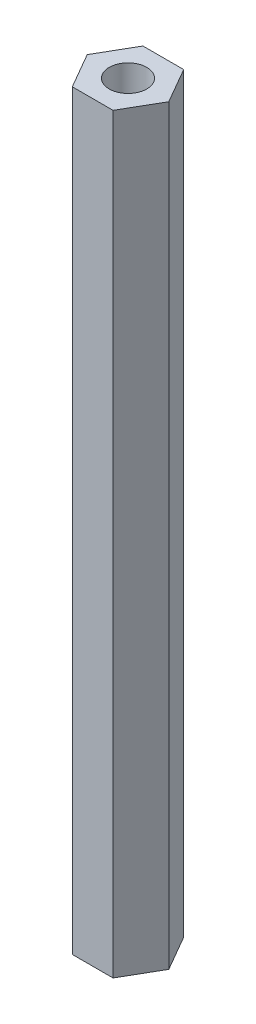
ISO-10303-21;
HEADER;
FILE_DESCRIPTION(('STEP AP214'),'2;1');
FILE_NAME('part.step','',(''),(''),'','','');
FILE_SCHEMA(('AUTOMOTIVE_DESIGN { 1 0 10303 214 1 1 1 1 }'));
ENDSEC;
DATA;
#1=APPLICATION_CONTEXT('core data for automotive mechanical design processes');
#2=APPLICATION_PROTOCOL_DEFINITION('international standard','automotive_design',2000,#1);
#3=PRODUCT_CONTEXT('',#1,'mechanical');
#4=PRODUCT('Part','Part','',(#3));
#5=PRODUCT_RELATED_PRODUCT_CATEGORY('part','',(#4));
#6=PRODUCT_DEFINITION_FORMATION('','',#4);
#7=PRODUCT_DEFINITION_CONTEXT('part definition',#1,'design');
#8=PRODUCT_DEFINITION('design','',#6,#7);
#9=PRODUCT_DEFINITION_SHAPE('','',#8);
#10=(LENGTH_UNIT() NAMED_UNIT(*) SI_UNIT(.MILLI.,.METRE.));
#11=(NAMED_UNIT(*) PLANE_ANGLE_UNIT() SI_UNIT($,.RADIAN.));
#12=(NAMED_UNIT(*) SI_UNIT($,.STERADIAN.) SOLID_ANGLE_UNIT());
#13=UNCERTAINTY_MEASURE_WITH_UNIT(LENGTH_MEASURE(1.E-05),#10,'distance_accuracy_value','');
#14=(GEOMETRIC_REPRESENTATION_CONTEXT(3) GLOBAL_UNCERTAINTY_ASSIGNED_CONTEXT((#13)) GLOBAL_UNIT_ASSIGNED_CONTEXT((#10,
#11,#12)) REPRESENTATION_CONTEXT('',''));
#15=CARTESIAN_POINT('',(0.,0.,0.));
#16=DIRECTION('',(0.,0.,1.));
#17=DIRECTION('',(1.,0.,0.));
#18=AXIS2_PLACEMENT_3D('',#15,#16,#17);
#19=CARTESIAN_POINT('',(1.35677313259565,50.,2.34999999999998));
#20=DIRECTION('',(-0.866025403784442,0.,-0.499999999999995));
#21=DIRECTION('',(-0.499999999999995,0.,0.866025403784442));
#22=AXIS2_PLACEMENT_3D('',#19,#20,#21);
#23=PLANE('',#22);
#24=DIRECTION('',(0.499999999999995,0.,-0.866025403784441));
#25=VECTOR('',#24,1.);
#26=CARTESIAN_POINT('',(1.35677313259565,0.,2.34999999999998));
#27=LINE('',#26,#25);
#28=CARTESIAN_POINT('',(1.35677313259565,0.,2.34999999999998));
#29=VERTEX_POINT('',#28);
#30=CARTESIAN_POINT('',(2.71354626519124,0.,0.));
#31=VERTEX_POINT('',#30);
#32=EDGE_CURVE('E121',#29,#31,#27,.T.);
#33=ORIENTED_EDGE('',*,*,#32,.T.);
#34=DIRECTION('',(0.,-1.,0.));
#35=VECTOR('',#34,1.);
#36=CARTESIAN_POINT('',(2.71354626519124,50.,0.));
#37=LINE('',#36,#35);
#38=CARTESIAN_POINT('',(2.71354626519124,50.,0.));
#39=VERTEX_POINT('',#38);
#40=EDGE_CURVE('E11',#39,#31,#37,.T.);
#41=ORIENTED_EDGE('',*,*,#40,.F.);
#42=DIRECTION('',(0.499999999999995,0.,-0.866025403784441));
#43=VECTOR('',#42,1.);
#44=CARTESIAN_POINT('',(1.35677313259565,50.,2.34999999999998));
#45=LINE('',#44,#43);
#46=CARTESIAN_POINT('',(1.35677313259565,50.,2.34999999999998));
#47=VERTEX_POINT('',#46);
#48=EDGE_CURVE('E132',#47,#39,#45,.T.);
#49=ORIENTED_EDGE('',*,*,#48,.F.);
#50=DIRECTION('',(0.,-1.,0.));
#51=VECTOR('',#50,1.);
#52=CARTESIAN_POINT('',(1.35677313259565,50.,2.34999999999998));
#53=LINE('',#52,#51);
#54=EDGE_CURVE('E117',#47,#29,#53,.T.);
#55=ORIENTED_EDGE('',*,*,#54,.T.);
#56=EDGE_LOOP('',(#33,#41,#49,#55));
#57=FACE_BOUND('',#56,.T.);
#58=ADVANCED_FACE('F37',(#57),#23,.F.);
#59=CARTESIAN_POINT('',(2.71354626519124,50.,0.));
#60=DIRECTION('',(-0.866025403784438,0.,0.500000000000001));
#61=DIRECTION('',(0.500000000000001,0.,0.866025403784438));
#62=AXIS2_PLACEMENT_3D('',#59,#60,#61);
#63=PLANE('',#62);
#64=DIRECTION('',(-0.500000000000001,0.,-0.866025403784438));
#65=VECTOR('',#64,1.);
#66=CARTESIAN_POINT('',(2.71354626519124,0.,0.));
#67=LINE('',#66,#65);
#68=CARTESIAN_POINT('',(1.35677313259561,0.,-2.35));
#69=VERTEX_POINT('',#68);
#70=EDGE_CURVE('E124',#31,#69,#67,.T.);
#71=ORIENTED_EDGE('',*,*,#70,.T.);
#72=DIRECTION('',(0.,-1.,0.));
#73=VECTOR('',#72,1.);
#74=CARTESIAN_POINT('',(1.35677313259561,50.,-2.35));
#75=LINE('',#74,#73);
#76=CARTESIAN_POINT('',(1.35677313259561,50.,-2.35));
#77=VERTEX_POINT('',#76);
#78=EDGE_CURVE('E45',#77,#69,#75,.T.);
#79=ORIENTED_EDGE('',*,*,#78,.F.);
#80=DIRECTION('',(-0.500000000000001,0.,-0.866025403784438));
#81=VECTOR('',#80,1.);
#82=CARTESIAN_POINT('',(2.71354626519124,50.,0.));
#83=LINE('',#82,#81);
#84=EDGE_CURVE('E90',#39,#77,#83,.T.);
#85=ORIENTED_EDGE('',*,*,#84,.F.);
#86=ORIENTED_EDGE('',*,*,#40,.T.);
#87=EDGE_LOOP('',(#71,#79,#85,#86));
#88=FACE_BOUND('',#87,.T.);
#89=ADVANCED_FACE('F157',(#88),#63,.F.);
#90=CARTESIAN_POINT('',(1.35677313259561,50.,-2.35));
#91=DIRECTION('',(0.,0.,1.));
#92=DIRECTION('',(1.,0.,0.));
#93=AXIS2_PLACEMENT_3D('',#90,#91,#92);
#94=PLANE('',#93);
#95=DIRECTION('',(-1.,0.,0.));
#96=VECTOR('',#95,1.);
#97=CARTESIAN_POINT('',(1.35677313259561,0.,-2.35));
#98=LINE('',#97,#96);
#99=CARTESIAN_POINT('',(-1.35677313259563,0.,-2.34999999999999));
#100=VERTEX_POINT('',#99);
#101=EDGE_CURVE('E127',#69,#100,#98,.T.);
#102=ORIENTED_EDGE('',*,*,#101,.T.);
#103=DIRECTION('',(0.,-1.,0.));
#104=VECTOR('',#103,1.);
#105=CARTESIAN_POINT('',(-1.35677313259563,50.,-2.34999999999999));
#106=LINE('',#105,#104);
#107=CARTESIAN_POINT('',(-1.35677313259563,50.,-2.34999999999999));
#108=VERTEX_POINT('',#107);
#109=EDGE_CURVE('E112',#108,#100,#106,.T.);
#110=ORIENTED_EDGE('',*,*,#109,.F.);
#111=DIRECTION('',(-1.,0.,0.));
#112=VECTOR('',#111,1.);
#113=CARTESIAN_POINT('',(1.35677313259561,50.,-2.35));
#114=LINE('',#113,#112);
#115=EDGE_CURVE('E103',#77,#108,#114,.T.);
#116=ORIENTED_EDGE('',*,*,#115,.F.);
#117=ORIENTED_EDGE('',*,*,#78,.T.);
#118=EDGE_LOOP('',(#102,#110,#116,#117));
#119=FACE_BOUND('',#118,.T.);
#120=ADVANCED_FACE('F138',(#119),#94,.F.);
#121=CARTESIAN_POINT('',(-1.35677313259563,50.,-2.34999999999999));
#122=DIRECTION('',(0.866025403784442,0.,0.499999999999995));
#123=DIRECTION('',(0.499999999999995,0.,-0.866025403784442));
#124=AXIS2_PLACEMENT_3D('',#121,#122,#123);
#125=PLANE('',#124);
#126=DIRECTION('',(-0.499999999999995,0.,0.866025403784441));
#127=VECTOR('',#126,1.);
#128=CARTESIAN_POINT('',(-1.35677313259563,0.,-2.34999999999999));
#129=LINE('',#128,#127);
#130=CARTESIAN_POINT('',(-2.71354626519124,0.,0.));
#131=VERTEX_POINT('',#130);
#132=EDGE_CURVE('E111',#100,#131,#129,.T.);
#133=ORIENTED_EDGE('',*,*,#132,.T.);
#134=DIRECTION('',(0.,-1.,0.));
#135=VECTOR('',#134,1.);
#136=CARTESIAN_POINT('',(-2.71354626519124,50.,0.));
#137=LINE('',#136,#135);
#138=CARTESIAN_POINT('',(-2.71354626519124,50.,0.));
#139=VERTEX_POINT('',#138);
#140=EDGE_CURVE('E108',#139,#131,#137,.T.);
#141=ORIENTED_EDGE('',*,*,#140,.F.);
#142=DIRECTION('',(-0.499999999999995,0.,0.866025403784441));
#143=VECTOR('',#142,1.);
#144=CARTESIAN_POINT('',(-1.35677313259563,50.,-2.34999999999999));
#145=LINE('',#144,#143);
#146=EDGE_CURVE('E97',#108,#139,#145,.T.);
#147=ORIENTED_EDGE('',*,*,#146,.F.);
#148=ORIENTED_EDGE('',*,*,#109,.T.);
#149=EDGE_LOOP('',(#133,#141,#147,#148));
#150=FACE_BOUND('',#149,.T.);
#151=ADVANCED_FACE('F109',(#150),#125,.F.);
#152=CARTESIAN_POINT('',(-2.71354626519124,50.,0.));
#153=DIRECTION('',(0.866025403784435,0.,-0.500000000000007));
#154=DIRECTION('',(-0.500000000000007,0.,-0.866025403784435));
#155=AXIS2_PLACEMENT_3D('',#152,#153,#154);
#156=PLANE('',#155);
#157=DIRECTION('',(0.500000000000007,0.,0.866025403784435));
#158=VECTOR('',#157,1.);
#159=CARTESIAN_POINT('',(-2.71354626519124,0.,0.));
#160=LINE('',#159,#158);
#161=CARTESIAN_POINT('',(-1.3567731325956,0.,2.35000000000001));
#162=VERTEX_POINT('',#161);
#163=EDGE_CURVE('E76',#131,#162,#160,.T.);
#164=ORIENTED_EDGE('',*,*,#163,.T.);
#165=DIRECTION('',(0.,-1.,0.));
#166=VECTOR('',#165,1.);
#167=CARTESIAN_POINT('',(-1.3567731325956,50.,2.35000000000001));
#168=LINE('',#167,#166);
#169=CARTESIAN_POINT('',(-1.3567731325956,50.,2.35000000000001));
#170=VERTEX_POINT('',#169);
#171=EDGE_CURVE('E113',#170,#162,#168,.T.);
#172=ORIENTED_EDGE('',*,*,#171,.F.);
#173=DIRECTION('',(0.500000000000007,0.,0.866025403784435));
#174=VECTOR('',#173,1.);
#175=CARTESIAN_POINT('',(-2.71354626519124,50.,0.));
#176=LINE('',#175,#174);
#177=EDGE_CURVE('E101',#139,#170,#176,.T.);
#178=ORIENTED_EDGE('',*,*,#177,.F.);
#179=ORIENTED_EDGE('',*,*,#140,.T.);
#180=EDGE_LOOP('',(#164,#172,#178,#179));
#181=FACE_BOUND('',#180,.T.);
#182=ADVANCED_FACE('F115',(#181),#156,.F.);
#183=CARTESIAN_POINT('',(-1.3567731325956,50.,2.35000000000001));
#184=DIRECTION('',(0.,0.,-1.));
#185=DIRECTION('',(-1.,0.,0.));
#186=AXIS2_PLACEMENT_3D('',#183,#184,#185);
#187=PLANE('',#186);
#188=DIRECTION('',(1.,0.,0.));
#189=VECTOR('',#188,1.);
#190=CARTESIAN_POINT('',(-1.3567731325956,0.,2.35000000000001));
#191=LINE('',#190,#189);
#192=EDGE_CURVE('E82',#162,#29,#191,.T.);
#193=ORIENTED_EDGE('',*,*,#192,.T.);
#194=ORIENTED_EDGE('',*,*,#54,.F.);
#195=DIRECTION('',(1.,0.,0.));
#196=VECTOR('',#195,1.);
#197=CARTESIAN_POINT('',(-1.3567731325956,50.,2.35000000000001));
#198=LINE('',#197,#196);
#199=EDGE_CURVE('E53',#170,#47,#198,.T.);
#200=ORIENTED_EDGE('',*,*,#199,.F.);
#201=ORIENTED_EDGE('',*,*,#171,.T.);
#202=EDGE_LOOP('',(#193,#194,#200,#201));
#203=FACE_BOUND('',#202,.T.);
#204=ADVANCED_FACE('F145',(#203),#187,.F.);
#205=CARTESIAN_POINT('',(0.,50.,0.));
#206=DIRECTION('',(0.,1.,0.));
#207=DIRECTION('',(0.,0.,1.));
#208=AXIS2_PLACEMENT_3D('',#205,#206,#207);
#209=PLANE('',#208);
#210=CARTESIAN_POINT('',(0.,50.,0.));
#211=DIRECTION('',(0.,1.,0.));
#212=DIRECTION('',(0.,0.,1.));
#213=AXIS2_PLACEMENT_3D('',#210,#211,#212);
#214=CIRCLE('',#213,1.24999999999999);
#215=CARTESIAN_POINT('',(0.,50.,1.24999999999999));
#216=VERTEX_POINT('',#215);
#217=EDGE_CURVE('E214',#216,#216,#214,.T.);
#218=ORIENTED_EDGE('',*,*,#217,.F.);
#219=EDGE_LOOP('',(#218));
#220=FACE_BOUND('',#219,.T.);
#221=ORIENTED_EDGE('',*,*,#48,.T.);
#222=ORIENTED_EDGE('',*,*,#84,.T.);
#223=ORIENTED_EDGE('',*,*,#115,.T.);
#224=ORIENTED_EDGE('',*,*,#146,.T.);
#225=ORIENTED_EDGE('',*,*,#177,.T.);
#226=ORIENTED_EDGE('',*,*,#199,.T.);
#227=EDGE_LOOP('',(#221,#222,#223,#224,#225,#226));
#228=FACE_BOUND('',#227,.T.);
#229=ADVANCED_FACE('F99',(#220,#228),#209,.T.);
#230=CARTESIAN_POINT('',(0.,0.,0.));
#231=DIRECTION('',(0.,1.,0.));
#232=DIRECTION('',(0.,0.,1.));
#233=AXIS2_PLACEMENT_3D('',#230,#231,#232);
#234=PLANE('',#233);
#235=CARTESIAN_POINT('',(0.,0.,0.));
#236=DIRECTION('',(0.,1.,0.));
#237=DIRECTION('',(0.,0.,1.));
#238=AXIS2_PLACEMENT_3D('',#235,#236,#237);
#239=CIRCLE('',#238,1.24999999999999);
#240=CARTESIAN_POINT('',(0.,0.,1.24999999999999));
#241=VERTEX_POINT('',#240);
#242=EDGE_CURVE('E125',#241,#241,#239,.T.);
#243=ORIENTED_EDGE('',*,*,#242,.T.);
#244=EDGE_LOOP('',(#243));
#245=FACE_BOUND('',#244,.T.);
#246=ORIENTED_EDGE('',*,*,#32,.F.);
#247=ORIENTED_EDGE('',*,*,#192,.F.);
#248=ORIENTED_EDGE('',*,*,#163,.F.);
#249=ORIENTED_EDGE('',*,*,#132,.F.);
#250=ORIENTED_EDGE('',*,*,#101,.F.);
#251=ORIENTED_EDGE('',*,*,#70,.F.);
#252=EDGE_LOOP('',(#246,#247,#248,#249,#250,#251));
#253=FACE_BOUND('',#252,.T.);
#254=ADVANCED_FACE('F141',(#245,#253),#234,.F.);
#255=CARTESIAN_POINT('',(0.,50.,0.));
#256=DIRECTION('',(0.,1.,0.));
#257=DIRECTION('',(0.,0.,1.));
#258=AXIS2_PLACEMENT_3D('',#255,#256,#257);
#259=CYLINDRICAL_SURFACE('',#258,1.24999999999999);
#260=ORIENTED_EDGE('',*,*,#242,.F.);
#261=EDGE_LOOP('',(#260));
#262=FACE_BOUND('',#261,.T.);
#263=ORIENTED_EDGE('',*,*,#217,.T.);
#264=EDGE_LOOP('',(#263));
#265=FACE_BOUND('',#264,.T.);
#266=ADVANCED_FACE('F194',(#262,#265),#259,.F.);
#267=CLOSED_SHELL('',(#58,#89,#120,#151,#182,#204,#229,#254,#266));
#268=MANIFOLD_SOLID_BREP('B2',#267);
#269=ADVANCED_BREP_SHAPE_REPRESENTATION('',(#18,#268),#14);
#270=SHAPE_DEFINITION_REPRESENTATION(#9,#269);
ENDSEC;
END-ISO-10303-21;
